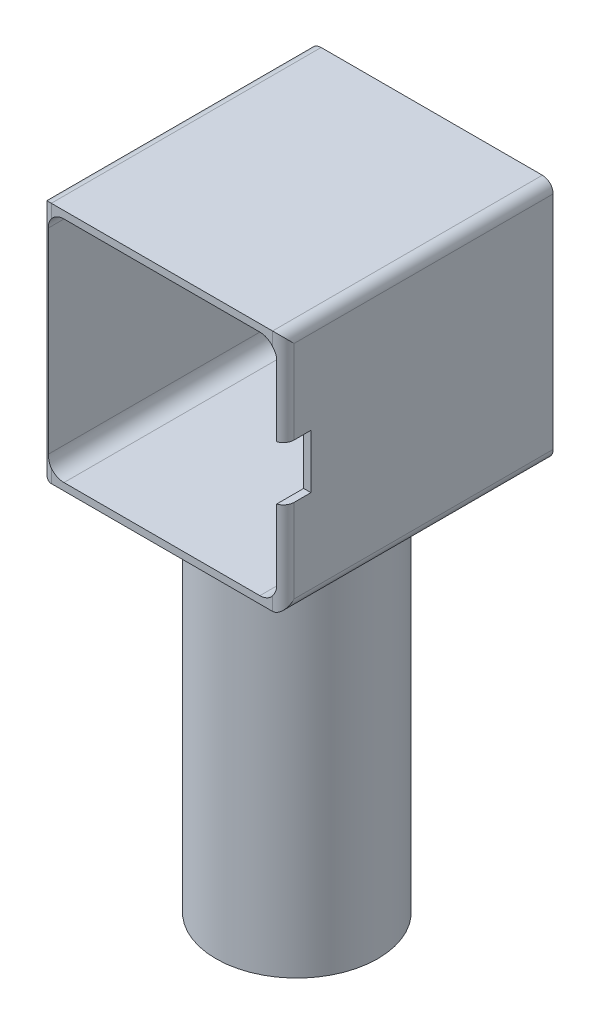
ISO-10303-21;
HEADER;
FILE_DESCRIPTION(('STEP AP214'),'2;1');
FILE_NAME('part.step','',(''),(''),'','','');
FILE_SCHEMA(('AUTOMOTIVE_DESIGN { 1 0 10303 214 1 1 1 1 }'));
ENDSEC;
DATA;
#1=APPLICATION_CONTEXT('core data for automotive mechanical design processes');
#2=APPLICATION_PROTOCOL_DEFINITION('international standard','automotive_design',2000,#1);
#3=PRODUCT_CONTEXT('',#1,'mechanical');
#4=PRODUCT('Part','Part','',(#3));
#5=PRODUCT_RELATED_PRODUCT_CATEGORY('part','',(#4));
#6=PRODUCT_DEFINITION_FORMATION('','',#4);
#7=PRODUCT_DEFINITION_CONTEXT('part definition',#1,'design');
#8=PRODUCT_DEFINITION('design','',#6,#7);
#9=PRODUCT_DEFINITION_SHAPE('','',#8);
#10=(LENGTH_UNIT() NAMED_UNIT(*) SI_UNIT(.MILLI.,.METRE.));
#11=(NAMED_UNIT(*) PLANE_ANGLE_UNIT() SI_UNIT($,.RADIAN.));
#12=(NAMED_UNIT(*) SI_UNIT($,.STERADIAN.) SOLID_ANGLE_UNIT());
#13=UNCERTAINTY_MEASURE_WITH_UNIT(LENGTH_MEASURE(1.E-05),#10,'distance_accuracy_value','');
#14=(GEOMETRIC_REPRESENTATION_CONTEXT(3) GLOBAL_UNCERTAINTY_ASSIGNED_CONTEXT((#13)) GLOBAL_UNIT_ASSIGNED_CONTEXT((#10,
#11,#12)) REPRESENTATION_CONTEXT('',''));
#15=CARTESIAN_POINT('',(0.,0.,0.));
#16=DIRECTION('',(0.,0.,1.));
#17=DIRECTION('',(1.,0.,0.));
#18=AXIS2_PLACEMENT_3D('',#15,#16,#17);
#19=CARTESIAN_POINT('',(20.5,0.,48.));
#20=DIRECTION('',(0.,-1.,0.));
#21=DIRECTION('',(1.,0.,0.));
#22=AXIS2_PLACEMENT_3D('',#19,#20,#21);
#23=CYLINDRICAL_SURFACE('',#22,2.);
#24=CARTESIAN_POINT('',(20.5,-5.,48.));
#25=DIRECTION('',(0.,-1.,0.));
#26=DIRECTION('',(0.,0.,-1.));
#27=AXIS2_PLACEMENT_3D('',#24,#25,#26);
#28=CIRCLE('',#27,2.);
#29=CARTESIAN_POINT('',(21.15,-5.,49.8914280319378));
#30=VERTEX_POINT('',#29);
#31=CARTESIAN_POINT('',(22.5,-5.,48.));
#32=VERTEX_POINT('',#31);
#33=EDGE_CURVE('E46',#30,#32,#28,.F.);
#34=ORIENTED_EDGE('',*,*,#33,.F.);
#35=DIRECTION('',(0.,-1.,0.));
#36=VECTOR('',#35,1.);
#37=CARTESIAN_POINT('',(21.15,-21.15,49.8914280319378));
#38=LINE('',#37,#36);
#39=CARTESIAN_POINT('',(21.15,-18.15,49.8914280319378));
#40=VERTEX_POINT('',#39);
#41=EDGE_CURVE('E302',#40,#30,#38,.F.);
#42=ORIENTED_EDGE('',*,*,#41,.F.);
#43=CARTESIAN_POINT('',(21.15,-18.15,49.8914280319378));
#44=CARTESIAN_POINT('',(21.1500002377145,-18.1931659292815,49.8914254732374));
#45=CARTESIAN_POINT('',(21.1490682197765,-18.2363258929418,49.8917485334484));
#46=CARTESIAN_POINT('',(21.1453442978245,-18.3225535555117,49.8930230890745));
#47=CARTESIAN_POINT('',(21.1425525106123,-18.3656212600451,49.8939745450237));
#48=CARTESIAN_POINT('',(21.1314007882093,-18.4944981475912,49.8977351670482));
#49=CARTESIAN_POINT('',(21.1202644737705,-18.5800571816038,49.9014506637507));
#50=CARTESIAN_POINT('',(21.0911021129438,-18.7474401312559,49.910712932653));
#51=CARTESIAN_POINT('',(21.0732747089154,-18.8293019603758,49.916206330638));
#52=CARTESIAN_POINT('',(21.0308803701078,-18.9911531761902,49.9283796767184));
#53=CARTESIAN_POINT('',(21.006312429265,-19.071142281434,49.9350598018872));
#54=CARTESIAN_POINT('',(20.9241268062252,-19.303557556923,49.9553198127258));
#55=CARTESIAN_POINT('',(20.8572474605051,-19.4528250373928,49.9694414006132));
#56=CARTESIAN_POINT('',(20.7382640068803,-19.6691928171086,49.9861723087932));
#57=CARTESIAN_POINT('',(20.6947596578589,-19.7409901568779,49.9910418374274));
#58=CARTESIAN_POINT('',(20.6017859499856,-19.8808364463295,49.9979506033793));
#59=CARTESIAN_POINT('',(20.5523115497021,-19.9488821562951,49.9999874301758));
#60=CARTESIAN_POINT('',(20.5,-20.0148056198971,50.));
#61=B_SPLINE_CURVE_WITH_KNOTS('',3,(#43,#44,#45,#46,#47,#48,#49,#50,#51,#52,#53,#54,#55,#56,#57,
#58,#59,#60),.UNSPECIFIED.,.F.,.F.,(4,2,2,2,2,2,2,2,4),(0.,0.129474767320734,0.258941403822209,
0.517647303133439,0.769212831410744,1.02081592772815,1.5107560057238,1.7627423991104,
2.01494309236108),.UNSPECIFIED.);
#62=CARTESIAN_POINT('',(20.5,-20.0148056198972,50.));
#63=VERTEX_POINT('',#62);
#64=EDGE_CURVE('E457',#40,#63,#61,.T.);
#65=ORIENTED_EDGE('',*,*,#64,.T.);
#66=DIRECTION('',(0.,1.,0.));
#67=VECTOR('',#66,1.);
#68=CARTESIAN_POINT('',(20.5,22.5,50.));
#69=LINE('',#68,#67);
#70=CARTESIAN_POINT('',(20.5,-22.5,50.));
#71=VERTEX_POINT('',#70);
#72=EDGE_CURVE('E61',#71,#63,#69,.T.);
#73=ORIENTED_EDGE('',*,*,#72,.F.);
#74=CARTESIAN_POINT('',(20.5,-20.5,48.));
#75=DIRECTION('',(0.,-0.707106781186547,-0.707106781186547));
#76=DIRECTION('',(0.,0.707106781186547,-0.707106781186547));
#77=AXIS2_PLACEMENT_3D('',#74,#75,#76);
#78=ELLIPSE('',#77,2.82842712474619,2.);
#79=CARTESIAN_POINT('',(22.5,-20.5,48.));
#80=VERTEX_POINT('',#79);
#81=EDGE_CURVE('E331',#71,#80,#78,.F.);
#82=ORIENTED_EDGE('',*,*,#81,.T.);
#83=DIRECTION('',(0.,1.,0.));
#84=VECTOR('',#83,1.);
#85=CARTESIAN_POINT('',(22.5,-22.5,48.));
#86=LINE('',#85,#84);
#87=EDGE_CURVE('E307',#32,#80,#86,.F.);
#88=ORIENTED_EDGE('',*,*,#87,.F.);
#89=EDGE_LOOP('',(#34,#42,#65,#73,#82,#88));
#90=FACE_BOUND('',#89,.T.);
#91=ADVANCED_FACE('F37',(#90),#23,.T.);
#92=CARTESIAN_POINT('',(0.,0.,50.));
#93=DIRECTION('',(0.,0.,1.));
#94=DIRECTION('',(1.,0.,0.));
#95=AXIS2_PLACEMENT_3D('',#92,#93,#94);
#96=PLANE('',#95);
#97=DIRECTION('',(-1.,0.,0.));
#98=VECTOR('',#97,1.);
#99=CARTESIAN_POINT('',(-22.5,22.5,50.));
#100=LINE('',#99,#98);
#101=CARTESIAN_POINT('',(20.5,22.5,50.));
#102=VERTEX_POINT('',#101);
#103=CARTESIAN_POINT('',(-20.5,22.5,50.));
#104=VERTEX_POINT('',#103);
#105=EDGE_CURVE('E256',#102,#104,#100,.T.);
#106=ORIENTED_EDGE('',*,*,#105,.T.);
#107=DIRECTION('',(0.,-1.,0.));
#108=VECTOR('',#107,1.);
#109=CARTESIAN_POINT('',(-20.5,-22.5,50.));
#110=LINE('',#109,#108);
#111=CARTESIAN_POINT('',(-20.5,20.0148056198971,50.));
#112=VERTEX_POINT('',#111);
#113=EDGE_CURVE('E290',#104,#112,#110,.T.);
#114=ORIENTED_EDGE('',*,*,#113,.T.);
#115=CARTESIAN_POINT('',(-18.15,18.15,50.));
#116=DIRECTION('',(0.,0.,1.));
#117=DIRECTION('',(1.,0.,0.));
#118=AXIS2_PLACEMENT_3D('',#115,#116,#117);
#119=CIRCLE('',#118,3.);
#120=CARTESIAN_POINT('',(-18.15,21.15,50.));
#121=VERTEX_POINT('',#120);
#122=EDGE_CURVE('E407',#112,#121,#119,.F.);
#123=ORIENTED_EDGE('',*,*,#122,.T.);
#124=DIRECTION('',(-1.,0.,0.));
#125=VECTOR('',#124,1.);
#126=CARTESIAN_POINT('',(-21.15,21.15,50.));
#127=LINE('',#126,#125);
#128=CARTESIAN_POINT('',(18.15,21.15,50.));
#129=VERTEX_POINT('',#128);
#130=EDGE_CURVE('E250',#129,#121,#127,.T.);
#131=ORIENTED_EDGE('',*,*,#130,.F.);
#132=CARTESIAN_POINT('',(18.15,18.15,50.));
#133=DIRECTION('',(0.,0.,1.));
#134=DIRECTION('',(1.,0.,0.));
#135=AXIS2_PLACEMENT_3D('',#132,#133,#134);
#136=CIRCLE('',#135,3.);
#137=CARTESIAN_POINT('',(20.5,20.0148056198972,50.));
#138=VERTEX_POINT('',#137);
#139=EDGE_CURVE('E382',#129,#138,#136,.F.);
#140=ORIENTED_EDGE('',*,*,#139,.T.);
#141=DIRECTION('',(0.,1.,0.));
#142=VECTOR('',#141,1.);
#143=CARTESIAN_POINT('',(20.5,22.5,50.));
#144=LINE('',#143,#142);
#145=EDGE_CURVE('E262',#138,#102,#144,.T.);
#146=ORIENTED_EDGE('',*,*,#145,.T.);
#147=EDGE_LOOP('',(#106,#114,#123,#131,#140,#146));
#148=FACE_BOUND('',#147,.T.);
#149=ADVANCED_FACE('F430',(#148),#96,.T.);
#150=CARTESIAN_POINT('',(22.5,22.5,50.));
#151=DIRECTION('',(-1.,0.,0.));
#152=DIRECTION('',(0.,-1.,0.));
#153=AXIS2_PLACEMENT_3D('',#150,#151,#152);
#154=PLANE('',#153);
#155=DIRECTION('',(0.,1.,0.));
#156=VECTOR('',#155,1.);
#157=CARTESIAN_POINT('',(22.5,5.,44.8914280319378));
#158=LINE('',#157,#156);
#159=CARTESIAN_POINT('',(22.5,-5.,44.8914280319378));
#160=VERTEX_POINT('',#159);
#161=CARTESIAN_POINT('',(22.5,5.,44.8914280319378));
#162=VERTEX_POINT('',#161);
#163=EDGE_CURVE('E196',#160,#162,#158,.T.);
#164=ORIENTED_EDGE('',*,*,#163,.F.);
#165=DIRECTION('',(0.,0.,-1.));
#166=VECTOR('',#165,1.);
#167=CARTESIAN_POINT('',(22.5,-5.,44.8914280319378));
#168=LINE('',#167,#166);
#169=EDGE_CURVE('E193',#32,#160,#168,.T.);
#170=ORIENTED_EDGE('',*,*,#169,.F.);
#171=ORIENTED_EDGE('',*,*,#87,.T.);
#172=DIRECTION('',(0.,0.,-1.));
#173=VECTOR('',#172,1.);
#174=CARTESIAN_POINT('',(22.5,-20.5,50.));
#175=LINE('',#174,#173);
#176=CARTESIAN_POINT('',(22.5,-20.5,0.));
#177=VERTEX_POINT('',#176);
#178=EDGE_CURVE('E309',#80,#177,#175,.T.);
#179=ORIENTED_EDGE('',*,*,#178,.T.);
#180=DIRECTION('',(0.,1.,0.));
#181=VECTOR('',#180,1.);
#182=CARTESIAN_POINT('',(22.5,22.5,0.));
#183=LINE('',#182,#181);
#184=CARTESIAN_POINT('',(22.5,20.5,0.));
#185=VERTEX_POINT('',#184);
#186=EDGE_CURVE('E249',#177,#185,#183,.T.);
#187=ORIENTED_EDGE('',*,*,#186,.T.);
#188=DIRECTION('',(0.,0.,-1.));
#189=VECTOR('',#188,1.);
#190=CARTESIAN_POINT('',(22.5,20.5,50.));
#191=LINE('',#190,#189);
#192=CARTESIAN_POINT('',(22.5,20.5,48.));
#193=VERTEX_POINT('',#192);
#194=EDGE_CURVE('E305',#185,#193,#191,.F.);
#195=ORIENTED_EDGE('',*,*,#194,.T.);
#196=CARTESIAN_POINT('',(22.5,5.,48.));
#197=VERTEX_POINT('',#196);
#198=EDGE_CURVE('E206',#193,#197,#86,.F.);
#199=ORIENTED_EDGE('',*,*,#198,.T.);
#200=DIRECTION('',(0.,0.,1.));
#201=VECTOR('',#200,1.);
#202=CARTESIAN_POINT('',(22.5,5.,44.8914280319378));
#203=LINE('',#202,#201);
#204=EDGE_CURVE('E53',#162,#197,#203,.T.);
#205=ORIENTED_EDGE('',*,*,#204,.F.);
#206=EDGE_LOOP('',(#164,#170,#171,#179,#187,#195,#199,#205));
#207=FACE_BOUND('',#206,.T.);
#208=ADVANCED_FACE('F204',(#207),#154,.F.);
#209=CARTESIAN_POINT('',(-22.5,22.5,50.));
#210=DIRECTION('',(0.,-1.,0.));
#211=DIRECTION('',(0.,0.,-1.));
#212=AXIS2_PLACEMENT_3D('',#209,#210,#211);
#213=PLANE('',#212);
#214=DIRECTION('',(-1.,0.,0.));
#215=VECTOR('',#214,1.);
#216=CARTESIAN_POINT('',(-22.5,22.5,0.));
#217=LINE('',#216,#215);
#218=CARTESIAN_POINT('',(20.5,22.5,0.));
#219=VERTEX_POINT('',#218);
#220=CARTESIAN_POINT('',(-20.5,22.5,0.));
#221=VERTEX_POINT('',#220);
#222=EDGE_CURVE('E265',#219,#221,#217,.T.);
#223=ORIENTED_EDGE('',*,*,#222,.T.);
#224=DIRECTION('',(0.,0.,-1.));
#225=VECTOR('',#224,1.);
#226=CARTESIAN_POINT('',(-20.5,22.5,50.));
#227=LINE('',#226,#225);
#228=EDGE_CURVE('E325',#221,#104,#227,.F.);
#229=ORIENTED_EDGE('',*,*,#228,.T.);
#230=ORIENTED_EDGE('',*,*,#105,.F.);
#231=DIRECTION('',(0.,0.,-1.));
#232=VECTOR('',#231,1.);
#233=CARTESIAN_POINT('',(20.5,22.5,50.));
#234=LINE('',#233,#232);
#235=EDGE_CURVE('E323',#102,#219,#234,.T.);
#236=ORIENTED_EDGE('',*,*,#235,.T.);
#237=EDGE_LOOP('',(#223,#229,#230,#236));
#238=FACE_BOUND('',#237,.T.);
#239=ADVANCED_FACE('F503',(#238),#213,.F.);
#240=CARTESIAN_POINT('',(-22.5,22.5,50.));
#241=DIRECTION('',(1.,0.,0.));
#242=DIRECTION('',(0.,1.,0.));
#243=AXIS2_PLACEMENT_3D('',#240,#241,#242);
#244=PLANE('',#243);
#245=DIRECTION('',(0.,-1.,0.));
#246=VECTOR('',#245,1.);
#247=CARTESIAN_POINT('',(-22.5,22.5,0.));
#248=LINE('',#247,#246);
#249=CARTESIAN_POINT('',(-22.5,20.5,0.));
#250=VERTEX_POINT('',#249);
#251=CARTESIAN_POINT('',(-22.5,-20.5,0.));
#252=VERTEX_POINT('',#251);
#253=EDGE_CURVE('E268',#250,#252,#248,.T.);
#254=ORIENTED_EDGE('',*,*,#253,.T.);
#255=DIRECTION('',(0.,0.,-1.));
#256=VECTOR('',#255,1.);
#257=CARTESIAN_POINT('',(-22.5,-20.5,50.));
#258=LINE('',#257,#256);
#259=CARTESIAN_POINT('',(-22.5,-20.5,48.));
#260=VERTEX_POINT('',#259);
#261=EDGE_CURVE('E299',#252,#260,#258,.F.);
#262=ORIENTED_EDGE('',*,*,#261,.T.);
#263=DIRECTION('',(0.,-1.,0.));
#264=VECTOR('',#263,1.);
#265=CARTESIAN_POINT('',(-22.5,22.5,48.));
#266=LINE('',#265,#264);
#267=CARTESIAN_POINT('',(-22.5,20.5,48.));
#268=VERTEX_POINT('',#267);
#269=EDGE_CURVE('E297',#260,#268,#266,.F.);
#270=ORIENTED_EDGE('',*,*,#269,.T.);
#271=DIRECTION('',(0.,0.,-1.));
#272=VECTOR('',#271,1.);
#273=CARTESIAN_POINT('',(-22.5,20.5,50.));
#274=LINE('',#273,#272);
#275=EDGE_CURVE('E295',#268,#250,#274,.T.);
#276=ORIENTED_EDGE('',*,*,#275,.T.);
#277=EDGE_LOOP('',(#254,#262,#270,#276));
#278=FACE_BOUND('',#277,.T.);
#279=ADVANCED_FACE('F575',(#278),#244,.F.);
#280=CARTESIAN_POINT('',(-22.5,-22.5,50.));
#281=DIRECTION('',(0.,1.,0.));
#282=DIRECTION('',(0.,0.,1.));
#283=AXIS2_PLACEMENT_3D('',#280,#281,#282);
#284=PLANE('',#283);
#285=CARTESIAN_POINT('',(0.,-22.5,25.));
#286=DIRECTION('',(0.,1.,0.));
#287=DIRECTION('',(0.,0.,1.));
#288=AXIS2_PLACEMENT_3D('',#285,#286,#287);
#289=CIRCLE('',#288,20.);
#290=CARTESIAN_POINT('',(0.,-22.5,45.));
#291=VERTEX_POINT('',#290);
#292=EDGE_CURVE('E340',#291,#291,#289,.T.);
#293=ORIENTED_EDGE('',*,*,#292,.T.);
#294=EDGE_LOOP('',(#293));
#295=FACE_BOUND('',#294,.T.);
#296=DIRECTION('',(1.,0.,0.));
#297=VECTOR('',#296,1.);
#298=CARTESIAN_POINT('',(-22.5,-22.5,0.));
#299=LINE('',#298,#297);
#300=CARTESIAN_POINT('',(-20.5,-22.5,0.));
#301=VERTEX_POINT('',#300);
#302=CARTESIAN_POINT('',(20.5,-22.5,0.));
#303=VERTEX_POINT('',#302);
#304=EDGE_CURVE('E260',#301,#303,#299,.T.);
#305=ORIENTED_EDGE('',*,*,#304,.T.);
#306=DIRECTION('',(0.,0.,-1.));
#307=VECTOR('',#306,1.);
#308=CARTESIAN_POINT('',(20.5,-22.5,50.));
#309=LINE('',#308,#307);
#310=EDGE_CURVE('E321',#303,#71,#309,.F.);
#311=ORIENTED_EDGE('',*,*,#310,.T.);
#312=DIRECTION('',(1.,0.,0.));
#313=VECTOR('',#312,1.);
#314=CARTESIAN_POINT('',(-22.5,-22.5,50.));
#315=LINE('',#314,#313);
#316=CARTESIAN_POINT('',(-20.5,-22.5,50.));
#317=VERTEX_POINT('',#316);
#318=EDGE_CURVE('E259',#317,#71,#315,.T.);
#319=ORIENTED_EDGE('',*,*,#318,.F.);
#320=DIRECTION('',(0.,0.,-1.));
#321=VECTOR('',#320,1.);
#322=CARTESIAN_POINT('',(-20.5,-22.5,50.));
#323=LINE('',#322,#321);
#324=EDGE_CURVE('E319',#317,#301,#323,.T.);
#325=ORIENTED_EDGE('',*,*,#324,.T.);
#326=EDGE_LOOP('',(#305,#311,#319,#325));
#327=FACE_BOUND('',#326,.T.);
#328=ADVANCED_FACE('F569',(#295,#327),#284,.F.);
#329=DIRECTION('',(1.,0.,0.));
#330=VECTOR('',#329,1.);
#331=CARTESIAN_POINT('',(-21.15,-21.15,50.));
#332=LINE('',#331,#330);
#333=CARTESIAN_POINT('',(-18.15,-21.15,50.));
#334=VERTEX_POINT('',#333);
#335=CARTESIAN_POINT('',(18.15,-21.15,50.));
#336=VERTEX_POINT('',#335);
#337=EDGE_CURVE('E240',#334,#336,#332,.T.);
#338=ORIENTED_EDGE('',*,*,#337,.F.);
#339=CARTESIAN_POINT('',(-18.15,-18.15,50.));
#340=DIRECTION('',(0.,0.,1.));
#341=DIRECTION('',(1.,0.,0.));
#342=AXIS2_PLACEMENT_3D('',#339,#340,#341);
#343=CIRCLE('',#342,3.);
#344=CARTESIAN_POINT('',(-20.5,-20.0148056198971,50.));
#345=VERTEX_POINT('',#344);
#346=EDGE_CURVE('E371',#334,#345,#343,.F.);
#347=ORIENTED_EDGE('',*,*,#346,.T.);
#348=DIRECTION('',(0.,-1.,0.));
#349=VECTOR('',#348,1.);
#350=CARTESIAN_POINT('',(-20.5,-22.5,50.));
#351=LINE('',#350,#349);
#352=EDGE_CURVE('E288',#345,#317,#351,.T.);
#353=ORIENTED_EDGE('',*,*,#352,.T.);
#354=ORIENTED_EDGE('',*,*,#318,.T.);
#355=ORIENTED_EDGE('',*,*,#72,.T.);
#356=CARTESIAN_POINT('',(18.15,-18.15,50.));
#357=DIRECTION('',(0.,0.,1.));
#358=DIRECTION('',(1.,0.,0.));
#359=AXIS2_PLACEMENT_3D('',#356,#357,#358);
#360=CIRCLE('',#359,3.);
#361=EDGE_CURVE('E455',#63,#336,#360,.F.);
#362=ORIENTED_EDGE('',*,*,#361,.T.);
#363=EDGE_LOOP('',(#338,#347,#353,#354,#355,#362));
#364=FACE_BOUND('',#363,.T.);
#365=ADVANCED_FACE('F438',(#364),#96,.T.);
#366=CARTESIAN_POINT('',(0.,0.,0.));
#367=DIRECTION('',(0.,0.,1.));
#368=DIRECTION('',(1.,0.,0.));
#369=AXIS2_PLACEMENT_3D('',#366,#367,#368);
#370=PLANE('',#369);
#371=CARTESIAN_POINT('',(-15.4997806436083,-15.499780643609,0.));
#372=DIRECTION('',(0.,0.,1.));
#373=DIRECTION('',(1.,0.,0.));
#374=AXIS2_PLACEMENT_3D('',#371,#372,#373);
#375=CIRCLE('',#374,1.50000000000046);
#376=CARTESIAN_POINT('',(-13.9997806436079,-15.499780643609,0.));
#377=VERTEX_POINT('',#376);
#378=EDGE_CURVE('E219',#377,#377,#375,.T.);
#379=ORIENTED_EDGE('',*,*,#378,.T.);
#380=EDGE_LOOP('',(#379));
#381=FACE_BOUND('',#380,.T.);
#382=CARTESIAN_POINT('',(15.4997806436099,-15.4997806436083,0.));
#383=DIRECTION('',(0.,0.,1.));
#384=DIRECTION('',(1.,0.,0.));
#385=AXIS2_PLACEMENT_3D('',#382,#383,#384);
#386=CIRCLE('',#385,1.50000000000122);
#387=CARTESIAN_POINT('',(16.9997806436111,-15.4997806436083,0.));
#388=VERTEX_POINT('',#387);
#389=EDGE_CURVE('E228',#388,#388,#386,.T.);
#390=ORIENTED_EDGE('',*,*,#389,.T.);
#391=EDGE_LOOP('',(#390));
#392=FACE_BOUND('',#391,.T.);
#393=CARTESIAN_POINT('',(15.4997806436092,15.4997806436099,0.));
#394=DIRECTION('',(0.,0.,1.));
#395=DIRECTION('',(1.,0.,0.));
#396=AXIS2_PLACEMENT_3D('',#393,#394,#395);
#397=CIRCLE('',#396,1.50000000000091);
#398=CARTESIAN_POINT('',(16.9997806436101,15.4997806436099,0.));
#399=VERTEX_POINT('',#398);
#400=EDGE_CURVE('E225',#399,#399,#397,.T.);
#401=ORIENTED_EDGE('',*,*,#400,.T.);
#402=EDGE_LOOP('',(#401));
#403=FACE_BOUND('',#402,.T.);
#404=CARTESIAN_POINT('',(0.,0.,0.));
#405=DIRECTION('',(0.,0.,1.));
#406=DIRECTION('',(1.,0.,0.));
#407=AXIS2_PLACEMENT_3D('',#404,#405,#406);
#408=CIRCLE('',#407,2.75);
#409=CARTESIAN_POINT('',(2.75,0.,0.));
#410=VERTEX_POINT('',#409);
#411=EDGE_CURVE('E221',#410,#410,#408,.T.);
#412=ORIENTED_EDGE('',*,*,#411,.T.);
#413=EDGE_LOOP('',(#412));
#414=FACE_BOUND('',#413,.T.);
#415=CARTESIAN_POINT('',(-15.499780643609,15.4997806436092,0.));
#416=DIRECTION('',(0.,0.,1.));
#417=DIRECTION('',(1.,0.,0.));
#418=AXIS2_PLACEMENT_3D('',#415,#416,#417);
#419=CIRCLE('',#418,1.5);
#420=CARTESIAN_POINT('',(-13.999780643609,15.4997806436092,0.));
#421=VERTEX_POINT('',#420);
#422=EDGE_CURVE('E224',#421,#421,#419,.T.);
#423=ORIENTED_EDGE('',*,*,#422,.T.);
#424=EDGE_LOOP('',(#423));
#425=FACE_BOUND('',#424,.T.);
#426=ORIENTED_EDGE('',*,*,#186,.F.);
#427=CARTESIAN_POINT('',(20.5,-20.5,0.));
#428=DIRECTION('',(0.,0.,1.));
#429=DIRECTION('',(1.,0.,0.));
#430=AXIS2_PLACEMENT_3D('',#427,#428,#429);
#431=CIRCLE('',#430,2.);
#432=EDGE_CURVE('E317',#177,#303,#431,.F.);
#433=ORIENTED_EDGE('',*,*,#432,.T.);
#434=ORIENTED_EDGE('',*,*,#304,.F.);
#435=CARTESIAN_POINT('',(-20.5,-20.5,0.));
#436=DIRECTION('',(0.,0.,1.));
#437=DIRECTION('',(1.,0.,0.));
#438=AXIS2_PLACEMENT_3D('',#435,#436,#437);
#439=CIRCLE('',#438,2.);
#440=EDGE_CURVE('E315',#301,#252,#439,.F.);
#441=ORIENTED_EDGE('',*,*,#440,.T.);
#442=ORIENTED_EDGE('',*,*,#253,.F.);
#443=CARTESIAN_POINT('',(-20.5,20.5,0.));
#444=DIRECTION('',(0.,0.,1.));
#445=DIRECTION('',(1.,0.,0.));
#446=AXIS2_PLACEMENT_3D('',#443,#444,#445);
#447=CIRCLE('',#446,2.);
#448=EDGE_CURVE('E313',#250,#221,#447,.F.);
#449=ORIENTED_EDGE('',*,*,#448,.T.);
#450=ORIENTED_EDGE('',*,*,#222,.F.);
#451=CARTESIAN_POINT('',(20.5,20.5,0.));
#452=DIRECTION('',(0.,0.,1.));
#453=DIRECTION('',(1.,0.,0.));
#454=AXIS2_PLACEMENT_3D('',#451,#452,#453);
#455=CIRCLE('',#454,2.);
#456=EDGE_CURVE('E311',#219,#185,#455,.F.);
#457=ORIENTED_EDGE('',*,*,#456,.T.);
#458=EDGE_LOOP('',(#426,#433,#434,#441,#442,#449,#450,#457));
#459=FACE_BOUND('',#458,.T.);
#460=ADVANCED_FACE('F510',(#381,#392,#403,#414,#425,#459),#370,.F.);
#461=CARTESIAN_POINT('',(21.15,-21.15,4.));
#462=DIRECTION('',(1.,0.,0.));
#463=DIRECTION('',(0.,0.,-1.));
#464=AXIS2_PLACEMENT_3D('',#461,#462,#463);
#465=PLANE('',#464);
#466=ORIENTED_EDGE('',*,*,#41,.T.);
#467=DIRECTION('',(0.,0.,-1.));
#468=VECTOR('',#467,1.);
#469=CARTESIAN_POINT('',(21.15,-4.99999999999999,4.00000000000001));
#470=LINE('',#469,#468);
#471=CARTESIAN_POINT('',(21.15,-5.,44.8914280319378));
#472=VERTEX_POINT('',#471);
#473=EDGE_CURVE('E212',#30,#472,#470,.T.);
#474=ORIENTED_EDGE('',*,*,#473,.T.);
#475=DIRECTION('',(0.,1.,0.));
#476=VECTOR('',#475,1.);
#477=CARTESIAN_POINT('',(21.15,-21.15,44.8914280319378));
#478=LINE('',#477,#476);
#479=CARTESIAN_POINT('',(21.15,5.,44.8914280319378));
#480=VERTEX_POINT('',#479);
#481=EDGE_CURVE('E11',#472,#480,#478,.T.);
#482=ORIENTED_EDGE('',*,*,#481,.T.);
#483=DIRECTION('',(0.,0.,1.));
#484=VECTOR('',#483,1.);
#485=CARTESIAN_POINT('',(21.15,4.99999999999999,4.));
#486=LINE('',#485,#484);
#487=CARTESIAN_POINT('',(21.15,5.,49.8914280319378));
#488=VERTEX_POINT('',#487);
#489=EDGE_CURVE('E190',#480,#488,#486,.T.);
#490=ORIENTED_EDGE('',*,*,#489,.T.);
#491=CARTESIAN_POINT('',(21.15,18.15,49.8914280319378));
#492=VERTEX_POINT('',#491);
#493=EDGE_CURVE('E301',#488,#492,#38,.F.);
#494=ORIENTED_EDGE('',*,*,#493,.T.);
#495=DIRECTION('',(0.,0.,1.));
#496=VECTOR('',#495,1.);
#497=CARTESIAN_POINT('',(21.15,18.15,4.));
#498=LINE('',#497,#496);
#499=CARTESIAN_POINT('',(21.15,18.15,4.));
#500=VERTEX_POINT('',#499);
#501=EDGE_CURVE('E369',#492,#500,#498,.F.);
#502=ORIENTED_EDGE('',*,*,#501,.T.);
#503=DIRECTION('',(0.,1.,0.));
#504=VECTOR('',#503,1.);
#505=CARTESIAN_POINT('',(21.15,-21.15,4.));
#506=LINE('',#505,#504);
#507=CARTESIAN_POINT('',(21.15,-18.15,4.));
#508=VERTEX_POINT('',#507);
#509=EDGE_CURVE('E236',#508,#500,#506,.T.);
#510=ORIENTED_EDGE('',*,*,#509,.F.);
#511=DIRECTION('',(0.,0.,1.));
#512=VECTOR('',#511,1.);
#513=CARTESIAN_POINT('',(21.15,-18.15,49.8914280319378));
#514=LINE('',#513,#512);
#515=EDGE_CURVE('E366',#508,#40,#514,.T.);
#516=ORIENTED_EDGE('',*,*,#515,.T.);
#517=EDGE_LOOP('',(#466,#474,#482,#490,#494,#502,#510,#516));
#518=FACE_BOUND('',#517,.T.);
#519=ADVANCED_FACE('F496',(#518),#465,.F.);
#520=CARTESIAN_POINT('',(-21.15,-21.15,4.));
#521=DIRECTION('',(0.,-1.,0.));
#522=DIRECTION('',(0.,0.,-1.));
#523=AXIS2_PLACEMENT_3D('',#520,#521,#522);
#524=PLANE('',#523);
#525=DIRECTION('',(1.,0.,0.));
#526=VECTOR('',#525,1.);
#527=CARTESIAN_POINT('',(-21.15,-21.15,4.));
#528=LINE('',#527,#526);
#529=CARTESIAN_POINT('',(-18.15,-21.15,4.));
#530=VERTEX_POINT('',#529);
#531=CARTESIAN_POINT('',(18.15,-21.15,4.));
#532=VERTEX_POINT('',#531);
#533=EDGE_CURVE('E246',#530,#532,#528,.T.);
#534=ORIENTED_EDGE('',*,*,#533,.F.);
#535=DIRECTION('',(0.,0.,1.));
#536=VECTOR('',#535,1.);
#537=CARTESIAN_POINT('',(-18.15,-21.15,49.8914280319378));
#538=LINE('',#537,#536);
#539=EDGE_CURVE('E345',#530,#334,#538,.T.);
#540=ORIENTED_EDGE('',*,*,#539,.T.);
#541=ORIENTED_EDGE('',*,*,#337,.T.);
#542=DIRECTION('',(0.,0.,1.));
#543=VECTOR('',#542,1.);
#544=CARTESIAN_POINT('',(18.15,-21.15,4.));
#545=LINE('',#544,#543);
#546=EDGE_CURVE('E343',#336,#532,#545,.F.);
#547=ORIENTED_EDGE('',*,*,#546,.T.);
#548=EDGE_LOOP('',(#534,#540,#541,#547));
#549=FACE_BOUND('',#548,.T.);
#550=ADVANCED_FACE('F489',(#549),#524,.F.);
#551=CARTESIAN_POINT('',(-21.15,-21.15,4.));
#552=DIRECTION('',(-1.,0.,0.));
#553=DIRECTION('',(0.,0.,1.));
#554=AXIS2_PLACEMENT_3D('',#551,#552,#553);
#555=PLANE('',#554);
#556=DIRECTION('',(0.,1.,0.));
#557=VECTOR('',#556,1.);
#558=CARTESIAN_POINT('',(-21.15,21.15,49.8914280319378));
#559=LINE('',#558,#557);
#560=CARTESIAN_POINT('',(-21.15,18.15,49.8914280319378));
#561=VERTEX_POINT('',#560);
#562=CARTESIAN_POINT('',(-21.15,-18.15,49.8914280319378));
#563=VERTEX_POINT('',#562);
#564=EDGE_CURVE('E292',#561,#563,#559,.F.);
#565=ORIENTED_EDGE('',*,*,#564,.T.);
#566=DIRECTION('',(0.,0.,1.));
#567=VECTOR('',#566,1.);
#568=CARTESIAN_POINT('',(-21.15,-18.15,4.));
#569=LINE('',#568,#567);
#570=CARTESIAN_POINT('',(-21.15,-18.15,4.));
#571=VERTEX_POINT('',#570);
#572=EDGE_CURVE('E351',#563,#571,#569,.F.);
#573=ORIENTED_EDGE('',*,*,#572,.T.);
#574=DIRECTION('',(0.,-1.,0.));
#575=VECTOR('',#574,1.);
#576=CARTESIAN_POINT('',(-21.15,-21.15,4.));
#577=LINE('',#576,#575);
#578=CARTESIAN_POINT('',(-21.15,18.15,4.));
#579=VERTEX_POINT('',#578);
#580=EDGE_CURVE('E243',#579,#571,#577,.T.);
#581=ORIENTED_EDGE('',*,*,#580,.F.);
#582=DIRECTION('',(0.,0.,1.));
#583=VECTOR('',#582,1.);
#584=CARTESIAN_POINT('',(-21.15,18.15,49.8914280319378));
#585=LINE('',#584,#583);
#586=EDGE_CURVE('E348',#579,#561,#585,.T.);
#587=ORIENTED_EDGE('',*,*,#586,.T.);
#588=EDGE_LOOP('',(#565,#573,#581,#587));
#589=FACE_BOUND('',#588,.T.);
#590=ADVANCED_FACE('F481',(#589),#555,.F.);
#591=CARTESIAN_POINT('',(-21.15,21.15,4.));
#592=DIRECTION('',(0.,1.,0.));
#593=DIRECTION('',(0.,0.,1.));
#594=AXIS2_PLACEMENT_3D('',#591,#592,#593);
#595=PLANE('',#594);
#596=DIRECTION('',(-1.,0.,0.));
#597=VECTOR('',#596,1.);
#598=CARTESIAN_POINT('',(-21.15,21.15,4.));
#599=LINE('',#598,#597);
#600=CARTESIAN_POINT('',(18.15,21.15,4.));
#601=VERTEX_POINT('',#600);
#602=CARTESIAN_POINT('',(-18.15,21.15,4.));
#603=VERTEX_POINT('',#602);
#604=EDGE_CURVE('E239',#601,#603,#599,.T.);
#605=ORIENTED_EDGE('',*,*,#604,.F.);
#606=DIRECTION('',(0.,0.,1.));
#607=VECTOR('',#606,1.);
#608=CARTESIAN_POINT('',(18.15,21.15,49.8914280319378));
#609=LINE('',#608,#607);
#610=EDGE_CURVE('E363',#601,#129,#609,.T.);
#611=ORIENTED_EDGE('',*,*,#610,.T.);
#612=ORIENTED_EDGE('',*,*,#130,.T.);
#613=DIRECTION('',(0.,0.,1.));
#614=VECTOR('',#613,1.);
#615=CARTESIAN_POINT('',(-18.15,21.15,4.));
#616=LINE('',#615,#614);
#617=EDGE_CURVE('E361',#121,#603,#616,.F.);
#618=ORIENTED_EDGE('',*,*,#617,.T.);
#619=EDGE_LOOP('',(#605,#611,#612,#618));
#620=FACE_BOUND('',#619,.T.);
#621=ADVANCED_FACE('F472',(#620),#595,.F.);
#622=CARTESIAN_POINT('',(0.,0.,4.));
#623=DIRECTION('',(0.,0.,-1.));
#624=DIRECTION('',(-1.,0.,0.));
#625=AXIS2_PLACEMENT_3D('',#622,#623,#624);
#626=PLANE('',#625);
#627=CARTESIAN_POINT('',(-15.4997806436083,-15.499780643609,4.));
#628=DIRECTION('',(0.,0.,-1.));
#629=DIRECTION('',(-1.,0.,0.));
#630=AXIS2_PLACEMENT_3D('',#627,#628,#629);
#631=CIRCLE('',#630,1.50000000000046);
#632=CARTESIAN_POINT('',(-16.9997806436088,-15.499780643609,4.));
#633=VERTEX_POINT('',#632);
#634=EDGE_CURVE('E253',#633,#633,#631,.T.);
#635=ORIENTED_EDGE('',*,*,#634,.T.);
#636=EDGE_LOOP('',(#635));
#637=FACE_BOUND('',#636,.T.);
#638=CARTESIAN_POINT('',(15.4997806436099,-15.4997806436083,4.));
#639=DIRECTION('',(0.,0.,-1.));
#640=DIRECTION('',(-1.,0.,0.));
#641=AXIS2_PLACEMENT_3D('',#638,#639,#640);
#642=CIRCLE('',#641,1.50000000000122);
#643=CARTESIAN_POINT('',(13.9997806436087,-15.4997806436083,4.));
#644=VERTEX_POINT('',#643);
#645=EDGE_CURVE('E281',#644,#644,#642,.T.);
#646=ORIENTED_EDGE('',*,*,#645,.T.);
#647=EDGE_LOOP('',(#646));
#648=FACE_BOUND('',#647,.T.);
#649=CARTESIAN_POINT('',(15.4997806436092,15.4997806436099,4.));
#650=DIRECTION('',(0.,0.,-1.));
#651=DIRECTION('',(-1.,0.,0.));
#652=AXIS2_PLACEMENT_3D('',#649,#650,#651);
#653=CIRCLE('',#652,1.50000000000091);
#654=CARTESIAN_POINT('',(13.9997806436083,15.4997806436099,4.));
#655=VERTEX_POINT('',#654);
#656=EDGE_CURVE('E278',#655,#655,#653,.T.);
#657=ORIENTED_EDGE('',*,*,#656,.T.);
#658=EDGE_LOOP('',(#657));
#659=FACE_BOUND('',#658,.T.);
#660=CARTESIAN_POINT('',(0.,0.,4.));
#661=DIRECTION('',(0.,0.,-1.));
#662=DIRECTION('',(-1.,0.,0.));
#663=AXIS2_PLACEMENT_3D('',#660,#661,#662);
#664=CIRCLE('',#663,2.75);
#665=CARTESIAN_POINT('',(-2.75,0.,4.));
#666=VERTEX_POINT('',#665);
#667=EDGE_CURVE('E275',#666,#666,#664,.T.);
#668=ORIENTED_EDGE('',*,*,#667,.T.);
#669=EDGE_LOOP('',(#668));
#670=FACE_BOUND('',#669,.T.);
#671=CARTESIAN_POINT('',(-15.499780643609,15.4997806436092,4.));
#672=DIRECTION('',(0.,0.,-1.));
#673=DIRECTION('',(-1.,0.,0.));
#674=AXIS2_PLACEMENT_3D('',#671,#672,#673);
#675=CIRCLE('',#674,1.5);
#676=CARTESIAN_POINT('',(-16.999780643609,15.4997806436092,4.));
#677=VERTEX_POINT('',#676);
#678=EDGE_CURVE('E235',#677,#677,#675,.T.);
#679=ORIENTED_EDGE('',*,*,#678,.T.);
#680=EDGE_LOOP('',(#679));
#681=FACE_BOUND('',#680,.T.);
#682=ORIENTED_EDGE('',*,*,#580,.T.);
#683=CARTESIAN_POINT('',(-18.15,-18.15,4.));
#684=DIRECTION('',(0.,0.,-1.));
#685=DIRECTION('',(-1.,0.,0.));
#686=AXIS2_PLACEMENT_3D('',#683,#684,#685);
#687=CIRCLE('',#686,3.);
#688=EDGE_CURVE('E359',#571,#530,#687,.F.);
#689=ORIENTED_EDGE('',*,*,#688,.T.);
#690=ORIENTED_EDGE('',*,*,#533,.T.);
#691=CARTESIAN_POINT('',(18.15,-18.15,4.));
#692=DIRECTION('',(0.,0.,-1.));
#693=DIRECTION('',(-1.,0.,0.));
#694=AXIS2_PLACEMENT_3D('',#691,#692,#693);
#695=CIRCLE('',#694,3.);
#696=EDGE_CURVE('E353',#532,#508,#695,.F.);
#697=ORIENTED_EDGE('',*,*,#696,.T.);
#698=ORIENTED_EDGE('',*,*,#509,.T.);
#699=CARTESIAN_POINT('',(18.15,18.15,4.));
#700=DIRECTION('',(0.,0.,-1.));
#701=DIRECTION('',(-1.,0.,0.));
#702=AXIS2_PLACEMENT_3D('',#699,#700,#701);
#703=CIRCLE('',#702,3.);
#704=EDGE_CURVE('E357',#500,#601,#703,.F.);
#705=ORIENTED_EDGE('',*,*,#704,.T.);
#706=ORIENTED_EDGE('',*,*,#604,.T.);
#707=CARTESIAN_POINT('',(-18.15,18.15,4.));
#708=DIRECTION('',(0.,0.,-1.));
#709=DIRECTION('',(-1.,0.,0.));
#710=AXIS2_PLACEMENT_3D('',#707,#708,#709);
#711=CIRCLE('',#710,3.);
#712=EDGE_CURVE('E355',#603,#579,#711,.F.);
#713=ORIENTED_EDGE('',*,*,#712,.T.);
#714=EDGE_LOOP('',(#682,#689,#690,#697,#698,#705,#706,#713));
#715=FACE_BOUND('',#714,.T.);
#716=ADVANCED_FACE('F478',(#637,#648,#659,#670,#681,#715),#626,.F.);
#717=CARTESIAN_POINT('',(-15.499780643609,15.4997806436092,0.));
#718=DIRECTION('',(0.,0.,1.));
#719=DIRECTION('',(1.,0.,0.));
#720=AXIS2_PLACEMENT_3D('',#717,#718,#719);
#721=CYLINDRICAL_SURFACE('',#720,1.5);
#722=ORIENTED_EDGE('',*,*,#422,.F.);
#723=EDGE_LOOP('',(#722));
#724=FACE_BOUND('',#723,.T.);
#725=ORIENTED_EDGE('',*,*,#678,.F.);
#726=EDGE_LOOP('',(#725));
#727=FACE_BOUND('',#726,.T.);
#728=ADVANCED_FACE('F542',(#724,#727),#721,.F.);
#729=CARTESIAN_POINT('',(0.,0.,0.));
#730=DIRECTION('',(0.,0.,1.));
#731=DIRECTION('',(1.,0.,0.));
#732=AXIS2_PLACEMENT_3D('',#729,#730,#731);
#733=CYLINDRICAL_SURFACE('',#732,2.75);
#734=ORIENTED_EDGE('',*,*,#411,.F.);
#735=EDGE_LOOP('',(#734));
#736=FACE_BOUND('',#735,.T.);
#737=ORIENTED_EDGE('',*,*,#667,.F.);
#738=EDGE_LOOP('',(#737));
#739=FACE_BOUND('',#738,.T.);
#740=ADVANCED_FACE('F538',(#736,#739),#733,.F.);
#741=CARTESIAN_POINT('',(15.4997806436092,15.4997806436099,0.));
#742=DIRECTION('',(0.,0.,1.));
#743=DIRECTION('',(1.,0.,0.));
#744=AXIS2_PLACEMENT_3D('',#741,#742,#743);
#745=CYLINDRICAL_SURFACE('',#744,1.50000000000091);
#746=ORIENTED_EDGE('',*,*,#400,.F.);
#747=EDGE_LOOP('',(#746));
#748=FACE_BOUND('',#747,.T.);
#749=ORIENTED_EDGE('',*,*,#656,.F.);
#750=EDGE_LOOP('',(#749));
#751=FACE_BOUND('',#750,.T.);
#752=ADVANCED_FACE('F541',(#748,#751),#745,.F.);
#753=CARTESIAN_POINT('',(15.4997806436099,-15.4997806436083,0.));
#754=DIRECTION('',(0.,0.,1.));
#755=DIRECTION('',(1.,0.,0.));
#756=AXIS2_PLACEMENT_3D('',#753,#754,#755);
#757=CYLINDRICAL_SURFACE('',#756,1.50000000000122);
#758=ORIENTED_EDGE('',*,*,#389,.F.);
#759=EDGE_LOOP('',(#758));
#760=FACE_BOUND('',#759,.T.);
#761=ORIENTED_EDGE('',*,*,#645,.F.);
#762=EDGE_LOOP('',(#761));
#763=FACE_BOUND('',#762,.T.);
#764=ADVANCED_FACE('F546',(#760,#763),#757,.F.);
#765=CARTESIAN_POINT('',(-15.4997806436083,-15.499780643609,0.));
#766=DIRECTION('',(0.,0.,1.));
#767=DIRECTION('',(1.,0.,0.));
#768=AXIS2_PLACEMENT_3D('',#765,#766,#767);
#769=CYLINDRICAL_SURFACE('',#768,1.50000000000046);
#770=ORIENTED_EDGE('',*,*,#378,.F.);
#771=EDGE_LOOP('',(#770));
#772=FACE_BOUND('',#771,.T.);
#773=ORIENTED_EDGE('',*,*,#634,.F.);
#774=EDGE_LOOP('',(#773));
#775=FACE_BOUND('',#774,.T.);
#776=ADVANCED_FACE('F536',(#772,#775),#769,.F.);
#777=CARTESIAN_POINT('',(0.,-93.5,25.));
#778=DIRECTION('',(0.,1.,0.));
#779=DIRECTION('',(0.,0.,1.));
#780=AXIS2_PLACEMENT_3D('',#777,#778,#779);
#781=CYLINDRICAL_SURFACE('',#780,15.);
#782=CARTESIAN_POINT('',(0.,-27.5,25.));
#783=DIRECTION('',(0.,1.,0.));
#784=DIRECTION('',(0.,0.,1.));
#785=AXIS2_PLACEMENT_3D('',#782,#783,#784);
#786=CIRCLE('',#785,15.);
#787=CARTESIAN_POINT('',(0.,-27.5,40.));
#788=VERTEX_POINT('',#787);
#789=EDGE_CURVE('E327',#788,#788,#786,.F.);
#790=ORIENTED_EDGE('',*,*,#789,.T.);
#791=EDGE_LOOP('',(#790));
#792=FACE_BOUND('',#791,.T.);
#793=CARTESIAN_POINT('',(0.,-93.5,25.));
#794=DIRECTION('',(0.,-1.,0.));
#795=DIRECTION('',(0.,0.,-1.));
#796=AXIS2_PLACEMENT_3D('',#793,#794,#795);
#797=CIRCLE('',#796,15.);
#798=CARTESIAN_POINT('',(0.,-93.5,10.));
#799=VERTEX_POINT('',#798);
#800=EDGE_CURVE('E216',#799,#799,#797,.T.);
#801=ORIENTED_EDGE('',*,*,#800,.F.);
#802=EDGE_LOOP('',(#801));
#803=FACE_BOUND('',#802,.T.);
#804=ADVANCED_FACE('F532',(#792,#803),#781,.T.);
#805=CARTESIAN_POINT('',(0.,-93.5,25.));
#806=DIRECTION('',(0.,-1.,0.));
#807=DIRECTION('',(0.,0.,-1.));
#808=AXIS2_PLACEMENT_3D('',#805,#806,#807);
#809=PLANE('',#808);
#810=ORIENTED_EDGE('',*,*,#800,.T.);
#811=EDGE_LOOP('',(#810));
#812=FACE_BOUND('',#811,.T.);
#813=ADVANCED_FACE('F528',(#812),#809,.T.);
#814=CARTESIAN_POINT('',(-20.5,20.5,50.));
#815=DIRECTION('',(0.,0.,-1.));
#816=DIRECTION('',(-1.,0.,0.));
#817=AXIS2_PLACEMENT_3D('',#814,#815,#816);
#818=CYLINDRICAL_SURFACE('',#817,2.);
#819=ORIENTED_EDGE('',*,*,#448,.F.);
#820=ORIENTED_EDGE('',*,*,#275,.F.);
#821=CARTESIAN_POINT('',(-20.5,20.5,48.));
#822=DIRECTION('',(0.,0.707106781186547,-0.707106781186547));
#823=DIRECTION('',(0.,-0.707106781186547,-0.707106781186547));
#824=AXIS2_PLACEMENT_3D('',#821,#822,#823);
#825=ELLIPSE('',#824,2.82842712474619,2.);
#826=EDGE_CURVE('E220',#104,#268,#825,.F.);
#827=ORIENTED_EDGE('',*,*,#826,.F.);
#828=ORIENTED_EDGE('',*,*,#228,.F.);
#829=EDGE_LOOP('',(#819,#820,#827,#828));
#830=FACE_BOUND('',#829,.T.);
#831=ADVANCED_FACE('F531',(#830),#818,.T.);
#832=CARTESIAN_POINT('',(-20.5,-20.5,50.));
#833=DIRECTION('',(0.,0.,-1.));
#834=DIRECTION('',(-1.,0.,0.));
#835=AXIS2_PLACEMENT_3D('',#832,#833,#834);
#836=CYLINDRICAL_SURFACE('',#835,2.);
#837=ORIENTED_EDGE('',*,*,#440,.F.);
#838=ORIENTED_EDGE('',*,*,#324,.F.);
#839=CARTESIAN_POINT('',(-20.5,-20.5,48.));
#840=DIRECTION('',(0.,-0.707106781186547,-0.707106781186547));
#841=DIRECTION('',(0.,0.707106781186547,-0.707106781186547));
#842=AXIS2_PLACEMENT_3D('',#839,#840,#841);
#843=ELLIPSE('',#842,2.82842712474619,2.);
#844=EDGE_CURVE('E328',#260,#317,#843,.F.);
#845=ORIENTED_EDGE('',*,*,#844,.F.);
#846=ORIENTED_EDGE('',*,*,#261,.F.);
#847=EDGE_LOOP('',(#837,#838,#845,#846));
#848=FACE_BOUND('',#847,.T.);
#849=ADVANCED_FACE('F394',(#848),#836,.T.);
#850=CARTESIAN_POINT('',(-20.5,0.,48.));
#851=DIRECTION('',(0.,1.,0.));
#852=DIRECTION('',(-1.,0.,0.));
#853=AXIS2_PLACEMENT_3D('',#850,#851,#852);
#854=CYLINDRICAL_SURFACE('',#853,2.);
#855=ORIENTED_EDGE('',*,*,#826,.T.);
#856=ORIENTED_EDGE('',*,*,#269,.F.);
#857=ORIENTED_EDGE('',*,*,#844,.T.);
#858=ORIENTED_EDGE('',*,*,#352,.F.);
#859=CARTESIAN_POINT('',(-20.5,-20.0148056198971,50.));
#860=CARTESIAN_POINT('',(-20.5537267562988,-19.9471179177914,49.9999826555088));
#861=CARTESIAN_POINT('',(-20.6044773012027,-19.8771388759572,49.997835679795));
#862=CARTESIAN_POINT('',(-20.699666039222,-19.7332311131638,49.9905846596781));
#863=CARTESIAN_POINT('',(-20.7441094454893,-19.6593057244325,49.9854830753338));
#864=CARTESIAN_POINT('',(-20.8252678112641,-19.5101312698879,49.9737859343309));
#865=CARTESIAN_POINT('',(-20.8621635966286,-19.4349764687614,49.9672359619907));
#866=CARTESIAN_POINT('',(-20.9295424889775,-19.2818736028962,49.9536314770865));
#867=CARTESIAN_POINT('',(-20.960024529291,-19.2039250760514,49.9465768808594));
#868=CARTESIAN_POINT('',(-21.0136714855746,-19.047786559348,49.9331030733036));
#869=CARTESIAN_POINT('',(-21.0370067962207,-18.9696561084,49.9266720755866));
#870=CARTESIAN_POINT('',(-21.0772545945996,-18.8116826372404,49.9149970356113));
#871=CARTESIAN_POINT('',(-21.0941682541512,-18.7318399322918,49.9097527768681));
#872=CARTESIAN_POINT('',(-21.1218181220488,-18.568714885466,49.9009398140947));
#873=CARTESIAN_POINT('',(-21.1323705809132,-18.4853984808296,49.8974214518449));
#874=CARTESIAN_POINT('',(-21.1464696753626,-18.3180587842532,49.8926402284812));
#875=CARTESIAN_POINT('',(-21.1500118045344,-18.2340350724618,49.8913788182417));
#876=CARTESIAN_POINT('',(-21.15,-18.15,49.8914280319378));
#877=B_SPLINE_CURVE_WITH_KNOTS('',3,(#859,#860,#861,#862,#863,#864,#865,#866,#867,#868,#869,
#870,#871,#872,#873,#874,#875,#876),.UNSPECIFIED.,.F.,.F.,(4,2,2,2,2,2,2,2,4),(0.,
0.259072781379408,0.517930163708853,0.76957541485716,1.02126248414576,1.26637250204408,
1.51143777090343,1.76327951073538,2.01528308814573),.UNSPECIFIED.);
#878=EDGE_CURVE('E374',#345,#563,#877,.T.);
#879=ORIENTED_EDGE('',*,*,#878,.T.);
#880=ORIENTED_EDGE('',*,*,#564,.F.);
#881=CARTESIAN_POINT('',(-21.15,18.15,49.8914280319378));
#882=CARTESIAN_POINT('',(-21.1500002377145,18.1931659292815,49.8914254732374));
#883=CARTESIAN_POINT('',(-21.1490682197765,18.2363258929418,49.8917485334484));
#884=CARTESIAN_POINT('',(-21.1453442978245,18.3225535555117,49.8930230890745));
#885=CARTESIAN_POINT('',(-21.1425525106123,18.3656212600452,49.8939745450237));
#886=CARTESIAN_POINT('',(-21.1314007882093,18.4944981475912,49.8977351670482));
#887=CARTESIAN_POINT('',(-21.1202644737705,18.5800571816038,49.9014506637507));
#888=CARTESIAN_POINT('',(-21.0911021129438,18.7474401312559,49.910712932653));
#889=CARTESIAN_POINT('',(-21.0732747089154,18.8293019603758,49.916206330638));
#890=CARTESIAN_POINT('',(-21.0308803701078,18.9911531761902,49.9283796767184));
#891=CARTESIAN_POINT('',(-21.006312429265,19.071142281434,49.9350598018872));
#892=CARTESIAN_POINT('',(-20.9241268062252,19.303557556923,49.9553198127258));
#893=CARTESIAN_POINT('',(-20.8572474605051,19.4528250373928,49.9694414006132));
#894=CARTESIAN_POINT('',(-20.7382640068803,19.6691928171086,49.9861723087932));
#895=CARTESIAN_POINT('',(-20.6947596578589,19.7409901568779,49.9910418374274));
#896=CARTESIAN_POINT('',(-20.6017859499856,19.8808364463295,49.9979506033793));
#897=CARTESIAN_POINT('',(-20.5523115497022,19.9488821562951,49.9999874301758));
#898=CARTESIAN_POINT('',(-20.5,20.0148056198971,50.));
#899=B_SPLINE_CURVE_WITH_KNOTS('',3,(#881,#882,#883,#884,#885,#886,#887,#888,#889,#890,#891,
#892,#893,#894,#895,#896,#897,#898),.UNSPECIFIED.,.F.,.F.,(4,2,2,2,2,2,2,2,4),(0.,
0.12947476732073,0.258941403822209,0.517647303133439,0.769212831410744,1.02081592772815,
1.51075600572379,1.76274239911039,2.01494309236106),.UNSPECIFIED.);
#900=EDGE_CURVE('E400',#561,#112,#899,.T.);
#901=ORIENTED_EDGE('',*,*,#900,.T.);
#902=ORIENTED_EDGE('',*,*,#113,.F.);
#903=EDGE_LOOP('',(#855,#856,#857,#858,#879,#880,#901,#902));
#904=FACE_BOUND('',#903,.T.);
#905=ADVANCED_FACE('F388',(#904),#854,.T.);
#906=CARTESIAN_POINT('',(20.5,-20.5,50.));
#907=DIRECTION('',(0.,0.,-1.));
#908=DIRECTION('',(-1.,0.,0.));
#909=AXIS2_PLACEMENT_3D('',#906,#907,#908);
#910=CYLINDRICAL_SURFACE('',#909,2.);
#911=ORIENTED_EDGE('',*,*,#432,.F.);
#912=ORIENTED_EDGE('',*,*,#178,.F.);
#913=ORIENTED_EDGE('',*,*,#81,.F.);
#914=ORIENTED_EDGE('',*,*,#310,.F.);
#915=EDGE_LOOP('',(#911,#912,#913,#914));
#916=FACE_BOUND('',#915,.T.);
#917=ADVANCED_FACE('F393',(#916),#910,.T.);
#918=CARTESIAN_POINT('',(20.5,20.5,50.));
#919=DIRECTION('',(0.,0.,-1.));
#920=DIRECTION('',(-1.,0.,0.));
#921=AXIS2_PLACEMENT_3D('',#918,#919,#920);
#922=CYLINDRICAL_SURFACE('',#921,2.);
#923=ORIENTED_EDGE('',*,*,#456,.F.);
#924=ORIENTED_EDGE('',*,*,#235,.F.);
#925=CARTESIAN_POINT('',(20.5,20.5,48.));
#926=DIRECTION('',(0.,0.707106781186547,-0.707106781186547));
#927=DIRECTION('',(0.,-0.707106781186547,-0.707106781186547));
#928=AXIS2_PLACEMENT_3D('',#925,#926,#927);
#929=ELLIPSE('',#928,2.82842712474619,2.);
#930=EDGE_CURVE('E215',#193,#102,#929,.F.);
#931=ORIENTED_EDGE('',*,*,#930,.F.);
#932=ORIENTED_EDGE('',*,*,#194,.F.);
#933=EDGE_LOOP('',(#923,#924,#931,#932));
#934=FACE_BOUND('',#933,.T.);
#935=ADVANCED_FACE('F443',(#934),#922,.T.);
#936=CARTESIAN_POINT('',(20.5,5.,48.));
#937=DIRECTION('',(0.,1.,0.));
#938=DIRECTION('',(0.,0.,1.));
#939=AXIS2_PLACEMENT_3D('',#936,#937,#938);
#940=CIRCLE('',#939,2.);
#941=EDGE_CURVE('E452',#197,#488,#940,.F.);
#942=ORIENTED_EDGE('',*,*,#941,.F.);
#943=ORIENTED_EDGE('',*,*,#198,.F.);
#944=ORIENTED_EDGE('',*,*,#930,.T.);
#945=ORIENTED_EDGE('',*,*,#145,.F.);
#946=CARTESIAN_POINT('',(20.5,20.0148056198972,50.));
#947=CARTESIAN_POINT('',(20.5537267562988,19.9471179177914,49.9999826555088));
#948=CARTESIAN_POINT('',(20.6044773012027,19.8771388759572,49.997835679795));
#949=CARTESIAN_POINT('',(20.699666039222,19.7332311131639,49.9905846596781));
#950=CARTESIAN_POINT('',(20.7441094454893,19.6593057244325,49.9854830753338));
#951=CARTESIAN_POINT('',(20.8252678112641,19.510131269888,49.9737859343309));
#952=CARTESIAN_POINT('',(20.8621635966286,19.4349764687614,49.9672359619907));
#953=CARTESIAN_POINT('',(20.9295424889775,19.2818736028962,49.9536314770865));
#954=CARTESIAN_POINT('',(20.960024529291,19.2039250760514,49.9465768808594));
#955=CARTESIAN_POINT('',(21.0136714855746,19.047786559348,49.9331030733036));
#956=CARTESIAN_POINT('',(21.0370067962207,18.9696561084,49.9266720755866));
#957=CARTESIAN_POINT('',(21.0772545945996,18.8116826372404,49.9149970356113));
#958=CARTESIAN_POINT('',(21.0941682541512,18.7318399322918,49.9097527768681));
#959=CARTESIAN_POINT('',(21.1218181220488,18.568714885466,49.9009398140947));
#960=CARTESIAN_POINT('',(21.1323705809132,18.4853984808296,49.8974214518449));
#961=CARTESIAN_POINT('',(21.1464696753626,18.3180587842532,49.8926402284812));
#962=CARTESIAN_POINT('',(21.1500118045344,18.2340350724618,49.8913788182417));
#963=CARTESIAN_POINT('',(21.15,18.15,49.8914280319378));
#964=B_SPLINE_CURVE_WITH_KNOTS('',3,(#946,#947,#948,#949,#950,#951,#952,#953,#954,#955,#956,
#957,#958,#959,#960,#961,#962,#963),.UNSPECIFIED.,.F.,.F.,(4,2,2,2,2,2,2,2,4),(0.,
0.259072781379408,0.517930163708852,0.769575414857154,1.02126248414576,1.26637250204408,
1.51143777090343,1.76327951073539,2.01528308814575),.UNSPECIFIED.);
#965=EDGE_CURVE('E408',#138,#492,#964,.T.);
#966=ORIENTED_EDGE('',*,*,#965,.T.);
#967=ORIENTED_EDGE('',*,*,#493,.F.);
#968=EDGE_LOOP('',(#942,#943,#944,#945,#966,#967));
#969=FACE_BOUND('',#968,.T.);
#970=ADVANCED_FACE('F432',(#969),#23,.T.);
#971=CARTESIAN_POINT('',(0.,-27.5,25.));
#972=DIRECTION('',(0.,1.,0.));
#973=DIRECTION('',(0.,0.,1.));
#974=AXIS2_PLACEMENT_3D('',#971,#972,#973);
#975=TOROIDAL_SURFACE('',#974,20.,5.);
#976=ORIENTED_EDGE('',*,*,#292,.F.);
#977=EDGE_LOOP('',(#976));
#978=FACE_BOUND('',#977,.T.);
#979=ORIENTED_EDGE('',*,*,#789,.F.);
#980=EDGE_LOOP('',(#979));
#981=FACE_BOUND('',#980,.T.);
#982=ADVANCED_FACE('F426',(#978,#981),#975,.F.);
#983=CARTESIAN_POINT('',(-18.15,-18.15,4.));
#984=DIRECTION('',(0.,0.,-1.));
#985=DIRECTION('',(-1.,0.,0.));
#986=AXIS2_PLACEMENT_3D('',#983,#984,#985);
#987=CYLINDRICAL_SURFACE('',#986,3.);
#988=ORIENTED_EDGE('',*,*,#688,.F.);
#989=ORIENTED_EDGE('',*,*,#572,.F.);
#990=ORIENTED_EDGE('',*,*,#878,.F.);
#991=ORIENTED_EDGE('',*,*,#346,.F.);
#992=ORIENTED_EDGE('',*,*,#539,.F.);
#993=EDGE_LOOP('',(#988,#989,#990,#991,#992));
#994=FACE_BOUND('',#993,.T.);
#995=ADVANCED_FACE('F384',(#994),#987,.F.);
#996=CARTESIAN_POINT('',(18.15,18.15,4.));
#997=DIRECTION('',(0.,0.,-1.));
#998=DIRECTION('',(-1.,0.,0.));
#999=AXIS2_PLACEMENT_3D('',#996,#997,#998);
#1000=CYLINDRICAL_SURFACE('',#999,3.);
#1001=ORIENTED_EDGE('',*,*,#704,.F.);
#1002=ORIENTED_EDGE('',*,*,#501,.F.);
#1003=ORIENTED_EDGE('',*,*,#965,.F.);
#1004=ORIENTED_EDGE('',*,*,#139,.F.);
#1005=ORIENTED_EDGE('',*,*,#610,.F.);
#1006=EDGE_LOOP('',(#1001,#1002,#1003,#1004,#1005));
#1007=FACE_BOUND('',#1006,.T.);
#1008=ADVANCED_FACE('F418',(#1007),#1000,.F.);
#1009=CARTESIAN_POINT('',(-18.15,18.15,4.));
#1010=DIRECTION('',(0.,0.,-1.));
#1011=DIRECTION('',(-1.,0.,0.));
#1012=AXIS2_PLACEMENT_3D('',#1009,#1010,#1011);
#1013=CYLINDRICAL_SURFACE('',#1012,3.);
#1014=ORIENTED_EDGE('',*,*,#712,.F.);
#1015=ORIENTED_EDGE('',*,*,#617,.F.);
#1016=ORIENTED_EDGE('',*,*,#122,.F.);
#1017=ORIENTED_EDGE('',*,*,#900,.F.);
#1018=ORIENTED_EDGE('',*,*,#586,.F.);
#1019=EDGE_LOOP('',(#1014,#1015,#1016,#1017,#1018));
#1020=FACE_BOUND('',#1019,.T.);
#1021=ADVANCED_FACE('F415',(#1020),#1013,.F.);
#1022=CARTESIAN_POINT('',(18.15,-18.15,4.));
#1023=DIRECTION('',(0.,0.,-1.));
#1024=DIRECTION('',(-1.,0.,0.));
#1025=AXIS2_PLACEMENT_3D('',#1022,#1023,#1024);
#1026=CYLINDRICAL_SURFACE('',#1025,3.);
#1027=ORIENTED_EDGE('',*,*,#696,.F.);
#1028=ORIENTED_EDGE('',*,*,#546,.F.);
#1029=ORIENTED_EDGE('',*,*,#361,.F.);
#1030=ORIENTED_EDGE('',*,*,#64,.F.);
#1031=ORIENTED_EDGE('',*,*,#515,.F.);
#1032=EDGE_LOOP('',(#1027,#1028,#1029,#1030,#1031));
#1033=FACE_BOUND('',#1032,.T.);
#1034=ADVANCED_FACE('F39',(#1033),#1026,.F.);
#1035=CARTESIAN_POINT('',(12.5,5.,44.8914280319378));
#1036=DIRECTION('',(0.,0.,-1.));
#1037=DIRECTION('',(-1.,0.,0.));
#1038=AXIS2_PLACEMENT_3D('',#1035,#1036,#1037);
#1039=PLANE('',#1038);
#1040=DIRECTION('',(1.,0.,0.));
#1041=VECTOR('',#1040,1.);
#1042=CARTESIAN_POINT('',(12.5,-5.,44.8914280319378));
#1043=LINE('',#1042,#1041);
#1044=EDGE_CURVE('E192',#472,#160,#1043,.T.);
#1045=ORIENTED_EDGE('',*,*,#1044,.T.);
#1046=ORIENTED_EDGE('',*,*,#163,.T.);
#1047=DIRECTION('',(1.,0.,0.));
#1048=VECTOR('',#1047,1.);
#1049=CARTESIAN_POINT('',(12.5,5.,44.8914280319378));
#1050=LINE('',#1049,#1048);
#1051=EDGE_CURVE('E186',#480,#162,#1050,.T.);
#1052=ORIENTED_EDGE('',*,*,#1051,.F.);
#1053=ORIENTED_EDGE('',*,*,#481,.F.);
#1054=EDGE_LOOP('',(#1045,#1046,#1052,#1053));
#1055=FACE_BOUND('',#1054,.T.);
#1056=ADVANCED_FACE('F197',(#1055),#1039,.F.);
#1057=CARTESIAN_POINT('',(12.5,-5.,44.8914280319378));
#1058=DIRECTION('',(0.,-1.,0.));
#1059=DIRECTION('',(0.,0.,-1.));
#1060=AXIS2_PLACEMENT_3D('',#1057,#1058,#1059);
#1061=PLANE('',#1060);
#1062=ORIENTED_EDGE('',*,*,#33,.T.);
#1063=ORIENTED_EDGE('',*,*,#169,.T.);
#1064=ORIENTED_EDGE('',*,*,#1044,.F.);
#1065=ORIENTED_EDGE('',*,*,#473,.F.);
#1066=EDGE_LOOP('',(#1062,#1063,#1064,#1065));
#1067=FACE_BOUND('',#1066,.T.);
#1068=ADVANCED_FACE('F518',(#1067),#1061,.F.);
#1069=CARTESIAN_POINT('',(12.5,5.,44.8914280319378));
#1070=DIRECTION('',(0.,1.,0.));
#1071=DIRECTION('',(0.,0.,1.));
#1072=AXIS2_PLACEMENT_3D('',#1069,#1070,#1071);
#1073=PLANE('',#1072);
#1074=ORIENTED_EDGE('',*,*,#1051,.T.);
#1075=ORIENTED_EDGE('',*,*,#204,.T.);
#1076=ORIENTED_EDGE('',*,*,#941,.T.);
#1077=ORIENTED_EDGE('',*,*,#489,.F.);
#1078=EDGE_LOOP('',(#1074,#1075,#1076,#1077));
#1079=FACE_BOUND('',#1078,.T.);
#1080=ADVANCED_FACE('F188',(#1079),#1073,.F.);
#1081=CLOSED_SHELL('',(#91,#149,#208,#239,#279,#328,#365,#460,#519,#550,#590,#621,#716,#728,
#740,#752,#764,#776,#804,#813,#831,#849,#905,#917,#935,#970,#982,#995,#1008,#1021,#1034,#1056,
#1068,#1080));
#1082=MANIFOLD_SOLID_BREP('B2',#1081);
#1083=ADVANCED_BREP_SHAPE_REPRESENTATION('',(#18,#1082),#14);
#1084=SHAPE_DEFINITION_REPRESENTATION(#9,#1083);
ENDSEC;
END-ISO-10303-21;
